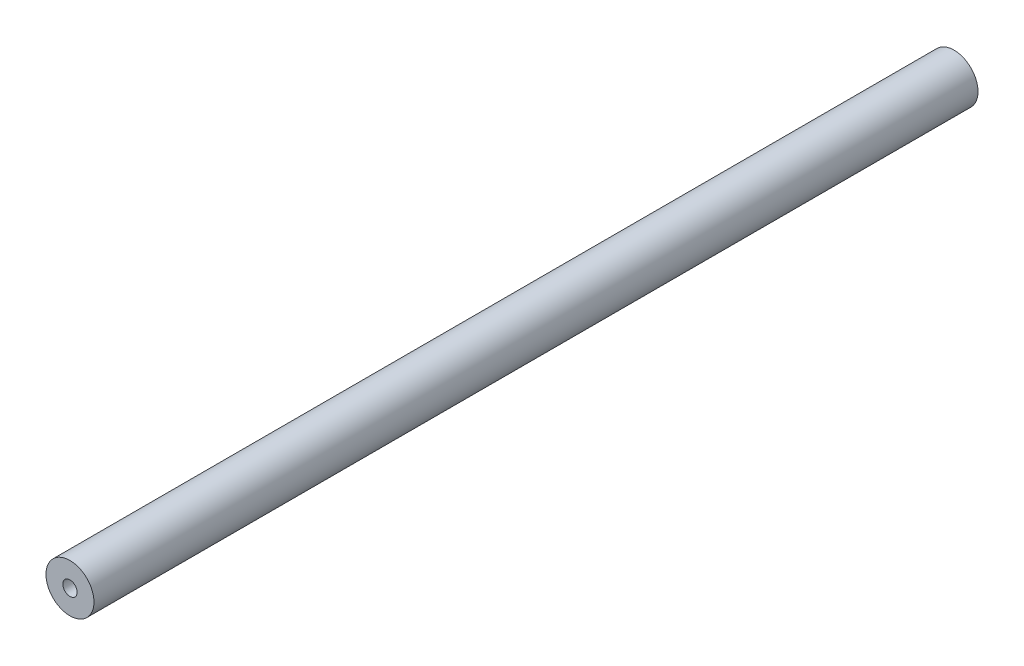
ISO-10303-21;
HEADER;
FILE_DESCRIPTION(('STEP AP214'),'2;1');
FILE_NAME('part.step','',(''),(''),'','','');
FILE_SCHEMA(('AUTOMOTIVE_DESIGN { 1 0 10303 214 1 1 1 1 }'));
ENDSEC;
DATA;
#1=APPLICATION_CONTEXT('core data for automotive mechanical design processes');
#2=APPLICATION_PROTOCOL_DEFINITION('international standard','automotive_design',2000,#1);
#3=PRODUCT_CONTEXT('',#1,'mechanical');
#4=PRODUCT('Part','Part','',(#3));
#5=PRODUCT_RELATED_PRODUCT_CATEGORY('part','',(#4));
#6=PRODUCT_DEFINITION_FORMATION('','',#4);
#7=PRODUCT_DEFINITION_CONTEXT('part definition',#1,'design');
#8=PRODUCT_DEFINITION('design','',#6,#7);
#9=PRODUCT_DEFINITION_SHAPE('','',#8);
#10=(LENGTH_UNIT() NAMED_UNIT(*) SI_UNIT(.MILLI.,.METRE.));
#11=(NAMED_UNIT(*) PLANE_ANGLE_UNIT() SI_UNIT($,.RADIAN.));
#12=(NAMED_UNIT(*) SI_UNIT($,.STERADIAN.) SOLID_ANGLE_UNIT());
#13=UNCERTAINTY_MEASURE_WITH_UNIT(LENGTH_MEASURE(1.E-05),#10,'distance_accuracy_value','');
#14=(GEOMETRIC_REPRESENTATION_CONTEXT(3) GLOBAL_UNCERTAINTY_ASSIGNED_CONTEXT((#13)) GLOBAL_UNIT_ASSIGNED_CONTEXT((#10,
#11,#12)) REPRESENTATION_CONTEXT('',''));
#15=CARTESIAN_POINT('',(0.,0.,0.));
#16=DIRECTION('',(0.,0.,1.));
#17=DIRECTION('',(1.,0.,0.));
#18=AXIS2_PLACEMENT_3D('',#15,#16,#17);
#19=CARTESIAN_POINT('',(110.,84.05,-251.860512242138));
#20=DIRECTION('',(0.,0.,1.));
#21=DIRECTION('',(1.,0.,0.));
#22=AXIS2_PLACEMENT_3D('',#19,#20,#21);
#23=CYLINDRICAL_SURFACE('',#22,6.34999999999999);
#24=CARTESIAN_POINT('',(110.,84.05,-233.9));
#25=DIRECTION('',(0.,0.,1.));
#26=DIRECTION('',(1.,0.,0.));
#27=AXIS2_PLACEMENT_3D('',#24,#25,#26);
#28=CIRCLE('',#27,6.34999999999999);
#29=CARTESIAN_POINT('',(116.35,84.05,-233.9));
#30=VERTEX_POINT('',#29);
#31=EDGE_CURVE('E11',#30,#30,#28,.F.);
#32=ORIENTED_EDGE('',*,*,#31,.F.);
#33=EDGE_LOOP('',(#32));
#34=FACE_BOUND('',#33,.T.);
#35=CARTESIAN_POINT('',(110.,84.05,0.));
#36=DIRECTION('',(0.,0.,1.));
#37=DIRECTION('',(1.,0.,0.));
#38=AXIS2_PLACEMENT_3D('',#35,#36,#37);
#39=CIRCLE('',#38,6.34999999999999);
#40=CARTESIAN_POINT('',(116.35,84.05,0.));
#41=VERTEX_POINT('',#40);
#42=EDGE_CURVE('E44',#41,#41,#39,.T.);
#43=ORIENTED_EDGE('',*,*,#42,.F.);
#44=EDGE_LOOP('',(#43));
#45=FACE_BOUND('',#44,.T.);
#46=ADVANCED_FACE('F37',(#34,#45),#23,.T.);
#47=CARTESIAN_POINT('',(110.,84.05,0.));
#48=DIRECTION('',(0.,0.,1.));
#49=DIRECTION('',(1.,0.,0.));
#50=AXIS2_PLACEMENT_3D('',#47,#48,#49);
#51=PLANE('',#50);
#52=CARTESIAN_POINT('',(110.,84.05,0.));
#53=DIRECTION('',(0.,0.,1.));
#54=DIRECTION('',(1.,0.,0.));
#55=AXIS2_PLACEMENT_3D('',#52,#53,#54);
#56=CIRCLE('',#55,1.89865);
#57=CARTESIAN_POINT('',(111.89865,84.05,0.));
#58=VERTEX_POINT('',#57);
#59=EDGE_CURVE('E60',#58,#58,#56,.T.);
#60=ORIENTED_EDGE('',*,*,#59,.F.);
#61=EDGE_LOOP('',(#60));
#62=FACE_BOUND('',#61,.T.);
#63=ORIENTED_EDGE('',*,*,#42,.T.);
#64=EDGE_LOOP('',(#63));
#65=FACE_BOUND('',#64,.T.);
#66=ADVANCED_FACE('F73',(#62,#65),#51,.T.);
#67=CARTESIAN_POINT('',(0.,0.,-233.9));
#68=DIRECTION('',(0.,0.,1.));
#69=DIRECTION('',(1.,0.,0.));
#70=AXIS2_PLACEMENT_3D('',#67,#68,#69);
#71=PLANE('',#70);
#72=CARTESIAN_POINT('',(110.,84.05,-233.9));
#73=DIRECTION('',(0.,0.,-1.));
#74=DIRECTION('',(-1.,0.,0.));
#75=AXIS2_PLACEMENT_3D('',#72,#73,#74);
#76=CIRCLE('',#75,1.89864999999999);
#77=CARTESIAN_POINT('',(108.10135,84.05,-233.9));
#78=VERTEX_POINT('',#77);
#79=EDGE_CURVE('E61',#78,#78,#76,.T.);
#80=ORIENTED_EDGE('',*,*,#79,.F.);
#81=EDGE_LOOP('',(#80));
#82=FACE_BOUND('',#81,.T.);
#83=ORIENTED_EDGE('',*,*,#31,.T.);
#84=EDGE_LOOP('',(#83));
#85=FACE_BOUND('',#84,.T.);
#86=ADVANCED_FACE('F81',(#82,#85),#71,.F.);
#87=CARTESIAN_POINT('',(110.,84.05,-12.83));
#88=DIRECTION('',(0.,0.,1.));
#89=DIRECTION('',(1.,0.,0.));
#90=AXIS2_PLACEMENT_3D('',#87,#88,#89);
#91=CONICAL_SURFACE('',#90,1.89865,1.02974425867666);
#92=CARTESIAN_POINT('',(110.,84.05,-13.9708240143167));
#93=VERTEX_POINT('',#92);
#94=VERTEX_LOOP('',#93);
#95=FACE_BOUND('',#94,.T.);
#96=CARTESIAN_POINT('',(110.,84.05,-12.83));
#97=DIRECTION('',(0.,0.,1.));
#98=DIRECTION('',(1.,0.,0.));
#99=AXIS2_PLACEMENT_3D('',#96,#97,#98);
#100=CIRCLE('',#99,1.89865);
#101=CARTESIAN_POINT('',(111.89865,84.05,-12.83));
#102=VERTEX_POINT('',#101);
#103=EDGE_CURVE('E64',#102,#102,#100,.T.);
#104=ORIENTED_EDGE('',*,*,#103,.T.);
#105=EDGE_LOOP('',(#104));
#106=FACE_BOUND('',#105,.T.);
#107=ADVANCED_FACE('F86',(#95,#106),#91,.F.);
#108=CARTESIAN_POINT('',(110.,84.05,0.));
#109=DIRECTION('',(0.,0.,1.));
#110=DIRECTION('',(1.,0.,0.));
#111=AXIS2_PLACEMENT_3D('',#108,#109,#110);
#112=CYLINDRICAL_SURFACE('',#111,1.89865);
#113=ORIENTED_EDGE('',*,*,#103,.F.);
#114=EDGE_LOOP('',(#113));
#115=FACE_BOUND('',#114,.T.);
#116=ORIENTED_EDGE('',*,*,#59,.T.);
#117=EDGE_LOOP('',(#116));
#118=FACE_BOUND('',#117,.T.);
#119=ADVANCED_FACE('F54',(#115,#118),#112,.F.);
#120=CARTESIAN_POINT('',(110.,84.05,-221.07));
#121=DIRECTION('',(0.,0.,-1.));
#122=DIRECTION('',(-1.,0.,0.));
#123=AXIS2_PLACEMENT_3D('',#120,#121,#122);
#124=CONICAL_SURFACE('',#123,1.89864999999999,1.02974425867665);
#125=CARTESIAN_POINT('',(110.,84.05,-219.929175985683));
#126=VERTEX_POINT('',#125);
#127=VERTEX_LOOP('',#126);
#128=FACE_BOUND('',#127,.T.);
#129=CARTESIAN_POINT('',(110.,84.05,-221.07));
#130=DIRECTION('',(0.,0.,-1.));
#131=DIRECTION('',(-1.,0.,0.));
#132=AXIS2_PLACEMENT_3D('',#129,#130,#131);
#133=CIRCLE('',#132,1.89864999999999);
#134=CARTESIAN_POINT('',(108.10135,84.05,-221.07));
#135=VERTEX_POINT('',#134);
#136=EDGE_CURVE('E58',#135,#135,#133,.T.);
#137=ORIENTED_EDGE('',*,*,#136,.T.);
#138=EDGE_LOOP('',(#137));
#139=FACE_BOUND('',#138,.T.);
#140=ADVANCED_FACE('F50',(#128,#139),#124,.F.);
#141=CARTESIAN_POINT('',(110.,84.05,-233.9));
#142=DIRECTION('',(0.,0.,-1.));
#143=DIRECTION('',(-1.,0.,0.));
#144=AXIS2_PLACEMENT_3D('',#141,#142,#143);
#145=CYLINDRICAL_SURFACE('',#144,1.89864999999999);
#146=ORIENTED_EDGE('',*,*,#136,.F.);
#147=EDGE_LOOP('',(#146));
#148=FACE_BOUND('',#147,.T.);
#149=ORIENTED_EDGE('',*,*,#79,.T.);
#150=EDGE_LOOP('',(#149));
#151=FACE_BOUND('',#150,.T.);
#152=ADVANCED_FACE('F53',(#148,#151),#145,.F.);
#153=CLOSED_SHELL('',(#46,#66,#86,#107,#119,#140,#152));
#154=MANIFOLD_SOLID_BREP('B2',#153);
#155=ADVANCED_BREP_SHAPE_REPRESENTATION('',(#18,#154),#14);
#156=SHAPE_DEFINITION_REPRESENTATION(#9,#155);
ENDSEC;
END-ISO-10303-21;
